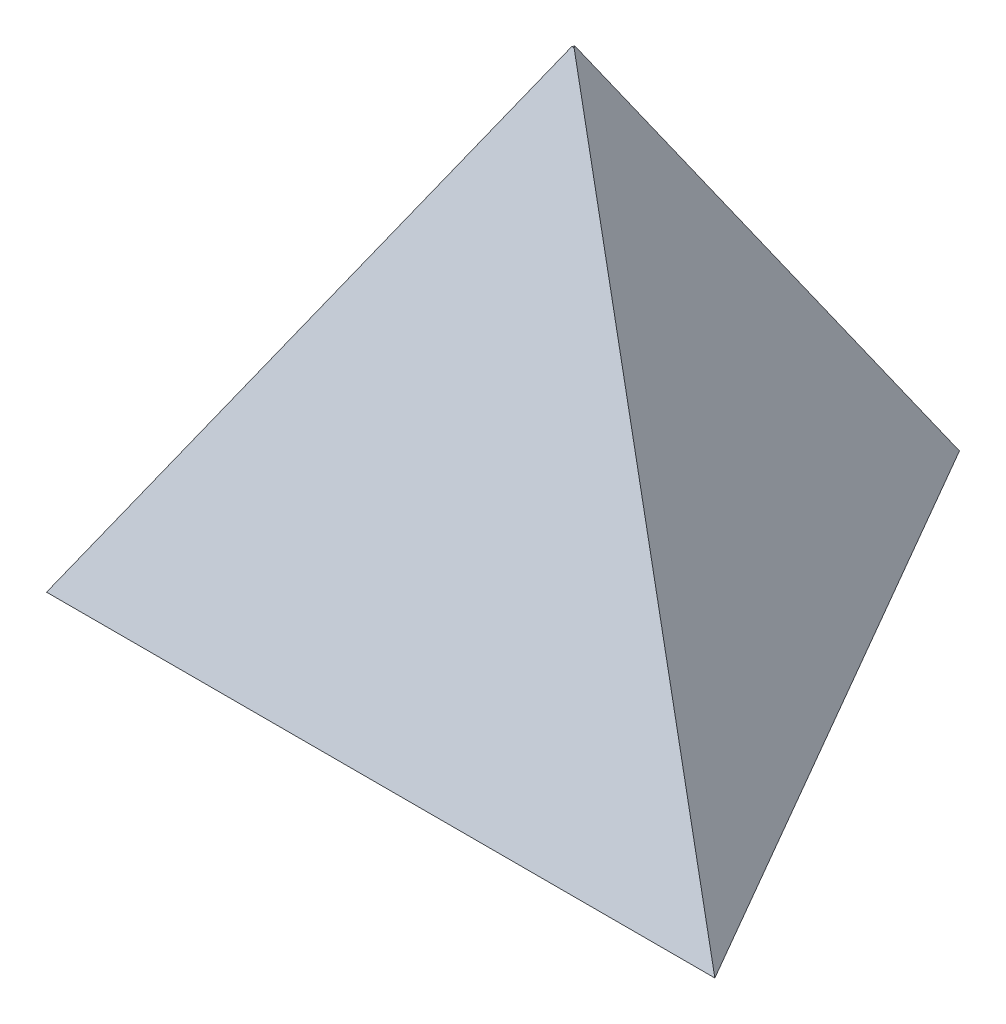
ISO-10303-21;
HEADER;
FILE_DESCRIPTION(('STEP AP214'),'2;1');
FILE_NAME('part.step','',(''),(''),'','','');
FILE_SCHEMA(('AUTOMOTIVE_DESIGN { 1 0 10303 214 1 1 1 1 }'));
ENDSEC;
DATA;
#1=APPLICATION_CONTEXT('core data for automotive mechanical design processes');
#2=APPLICATION_PROTOCOL_DEFINITION('international standard','automotive_design',2000,#1);
#3=PRODUCT_CONTEXT('',#1,'mechanical');
#4=PRODUCT('Part','Part','',(#3));
#5=PRODUCT_RELATED_PRODUCT_CATEGORY('part','',(#4));
#6=PRODUCT_DEFINITION_FORMATION('','',#4);
#7=PRODUCT_DEFINITION_CONTEXT('part definition',#1,'design');
#8=PRODUCT_DEFINITION('design','',#6,#7);
#9=PRODUCT_DEFINITION_SHAPE('','',#8);
#10=(LENGTH_UNIT() NAMED_UNIT(*) SI_UNIT(.MILLI.,.METRE.));
#11=(NAMED_UNIT(*) PLANE_ANGLE_UNIT() SI_UNIT($,.RADIAN.));
#12=(NAMED_UNIT(*) SI_UNIT($,.STERADIAN.) SOLID_ANGLE_UNIT());
#13=UNCERTAINTY_MEASURE_WITH_UNIT(LENGTH_MEASURE(1.E-05),#10,'distance_accuracy_value','');
#14=(GEOMETRIC_REPRESENTATION_CONTEXT(3) GLOBAL_UNCERTAINTY_ASSIGNED_CONTEXT((#13)) GLOBAL_UNIT_ASSIGNED_CONTEXT((#10,
#11,#12)) REPRESENTATION_CONTEXT('',''));
#15=CARTESIAN_POINT('',(0.,0.,0.));
#16=DIRECTION('',(0.,0.,1.));
#17=DIRECTION('',(1.,0.,0.));
#18=AXIS2_PLACEMENT_3D('',#15,#16,#17);
#19=CARTESIAN_POINT('',(-40.,0.,23.094010767585));
#20=DIRECTION('',(0.,0.333806859233772,0.942641491092178));
#21=DIRECTION('',(0.,-0.942641491092178,0.333806859233772));
#22=AXIS2_PLACEMENT_3D('',#19,#20,#21);
#23=PLANE('',#22);
#24=DIRECTION('',(1.,0.,0.));
#25=VECTOR('',#24,1.);
#26=CARTESIAN_POINT('',(-40.,0.,23.094010767585));
#27=LINE('',#26,#25);
#28=CARTESIAN_POINT('',(-40.,0.,23.094010767585));
#29=VERTEX_POINT('',#28);
#30=CARTESIAN_POINT('',(40.,0.,23.094010767585));
#31=VERTEX_POINT('',#30);
#32=EDGE_CURVE('E97',#29,#31,#27,.T.);
#33=ORIENTED_EDGE('',*,*,#32,.T.);
#34=DIRECTION('',(0.500532432884646,-0.816061503916281,0.288982534864089));
#35=VECTOR('',#34,1.);
#36=CARTESIAN_POINT('',(40.,0.,23.094010767585));
#37=LINE('',#36,#35);
#38=CARTESIAN_POINT('',(0.132161630749231,65.,0.0763035530896119));
#39=VERTEX_POINT('',#38);
#40=EDGE_CURVE('E11',#39,#31,#37,.T.);
#41=ORIENTED_EDGE('',*,*,#40,.F.);
#42=DIRECTION('',(-1.,0.,0.));
#43=VECTOR('',#42,1.);
#44=CARTESIAN_POINT('',(-40.,65.,0.0763035530896156));
#45=LINE('',#44,#43);
#46=CARTESIAN_POINT('',(-0.13216163074924,65.,0.0763035530896123));
#47=VERTEX_POINT('',#46);
#48=EDGE_CURVE('E108',#47,#39,#45,.F.);
#49=ORIENTED_EDGE('',*,*,#48,.F.);
#50=DIRECTION('',(-0.500532432884646,-0.816061503916281,0.288982534864089));
#51=VECTOR('',#50,1.);
#52=CARTESIAN_POINT('',(-40.,0.,23.094010767585));
#53=LINE('',#52,#51);
#54=EDGE_CURVE('E110',#47,#29,#53,.T.);
#55=ORIENTED_EDGE('',*,*,#54,.T.);
#56=EDGE_LOOP('',(#33,#41,#49,#55));
#57=FACE_BOUND('',#56,.T.);
#58=ADVANCED_FACE('F33',(#57),#23,.T.);
#59=CARTESIAN_POINT('',(40.,0.,23.094010767585));
#60=DIRECTION('',(0.816351477947069,0.333806859233772,-0.471320745546089));
#61=DIRECTION('',(-0.5,0.,-0.866025403784439));
#62=AXIS2_PLACEMENT_3D('',#59,#60,#61);
#63=PLANE('',#62);
#64=DIRECTION('',(-0.5,0.,-0.866025403784439));
#65=VECTOR('',#64,1.);
#66=CARTESIAN_POINT('',(40.,0.,23.094010767585));
#67=LINE('',#66,#65);
#68=CARTESIAN_POINT('',(0.,0.,-46.1880215351701));
#69=VERTEX_POINT('',#68);
#70=EDGE_CURVE('E100',#31,#69,#67,.T.);
#71=ORIENTED_EDGE('',*,*,#70,.T.);
#72=DIRECTION('',(0.,-0.816061503916281,-0.577965069728178));
#73=VECTOR('',#72,1.);
#74=CARTESIAN_POINT('',(0.,0.,-46.1880215351701));
#75=LINE('',#74,#73);
#76=CARTESIAN_POINT('',(0.,65.,-0.152607106179215));
#77=VERTEX_POINT('',#76);
#78=EDGE_CURVE('E42',#77,#69,#75,.T.);
#79=ORIENTED_EDGE('',*,*,#78,.F.);
#80=DIRECTION('',(0.5,0.,0.866025403784439));
#81=VECTOR('',#80,1.);
#82=CARTESIAN_POINT('',(20.0660808153746,65.,34.6028643748327));
#83=LINE('',#82,#81);
#84=EDGE_CURVE('E115',#39,#77,#83,.F.);
#85=ORIENTED_EDGE('',*,*,#84,.F.);
#86=ORIENTED_EDGE('',*,*,#40,.T.);
#87=EDGE_LOOP('',(#71,#79,#85,#86));
#88=FACE_BOUND('',#87,.T.);
#89=ADVANCED_FACE('F35',(#88),#63,.T.);
#90=CARTESIAN_POINT('',(0.,0.,-46.1880215351701));
#91=DIRECTION('',(-0.816351477947069,0.333806859233772,-0.471320745546089));
#92=DIRECTION('',(-0.5,0.,0.866025403784439));
#93=AXIS2_PLACEMENT_3D('',#90,#91,#92);
#94=PLANE('',#93);
#95=DIRECTION('',(-0.5,0.,0.866025403784439));
#96=VECTOR('',#95,1.);
#97=CARTESIAN_POINT('',(0.,0.,-46.1880215351701));
#98=LINE('',#97,#96);
#99=EDGE_CURVE('E107',#69,#29,#98,.T.);
#100=ORIENTED_EDGE('',*,*,#99,.T.);
#101=ORIENTED_EDGE('',*,*,#54,.F.);
#102=DIRECTION('',(0.5,0.,-0.866025403784439));
#103=VECTOR('',#102,1.);
#104=CARTESIAN_POINT('',(19.9339191846254,65.,-34.6791679279224));
#105=LINE('',#104,#103);
#106=EDGE_CURVE('E37',#77,#47,#105,.F.);
#107=ORIENTED_EDGE('',*,*,#106,.F.);
#108=ORIENTED_EDGE('',*,*,#78,.T.);
#109=EDGE_LOOP('',(#100,#101,#107,#108));
#110=FACE_BOUND('',#109,.T.);
#111=ADVANCED_FACE('F123',(#110),#94,.T.);
#112=CARTESIAN_POINT('',(0.,65.,0.));
#113=DIRECTION('',(0.,1.,0.));
#114=DIRECTION('',(0.,0.,1.));
#115=AXIS2_PLACEMENT_3D('',#112,#113,#114);
#116=PLANE('',#115);
#117=ORIENTED_EDGE('',*,*,#48,.T.);
#118=ORIENTED_EDGE('',*,*,#84,.T.);
#119=ORIENTED_EDGE('',*,*,#106,.T.);
#120=EDGE_LOOP('',(#117,#118,#119));
#121=FACE_BOUND('',#120,.T.);
#122=ADVANCED_FACE('F117',(#121),#116,.T.);
#123=CARTESIAN_POINT('',(0.,0.,0.));
#124=DIRECTION('',(0.,1.,0.));
#125=DIRECTION('',(0.,0.,1.));
#126=AXIS2_PLACEMENT_3D('',#123,#124,#125);
#127=PLANE('',#126);
#128=DIRECTION('',(0.5,0.,-0.866025403784439));
#129=VECTOR('',#128,1.);
#130=CARTESIAN_POINT('',(1.83744384682458,0.,-45.1271728355851));
#131=LINE('',#130,#129);
#132=CARTESIAN_POINT('',(0.,0.,-41.9446267368301));
#133=VERTEX_POINT('',#132);
#134=CARTESIAN_POINT('',(-36.3251123063508,0.,20.972313368415));
#135=VERTEX_POINT('',#134);
#136=EDGE_CURVE('E50',#133,#135,#131,.F.);
#137=ORIENTED_EDGE('',*,*,#136,.T.);
#138=DIRECTION('',(-1.,0.,0.));
#139=VECTOR('',#138,1.);
#140=CARTESIAN_POINT('',(-40.,0.,20.972313368415));
#141=LINE('',#140,#139);
#142=CARTESIAN_POINT('',(36.3251123063508,0.,20.972313368415));
#143=VERTEX_POINT('',#142);
#144=EDGE_CURVE('E88',#135,#143,#141,.F.);
#145=ORIENTED_EDGE('',*,*,#144,.T.);
#146=DIRECTION('',(0.5,0.,0.866025403784439));
#147=VECTOR('',#146,1.);
#148=CARTESIAN_POINT('',(38.1625561531754,0.,24.15485946717));
#149=LINE('',#148,#147);
#150=EDGE_CURVE('E96',#143,#133,#149,.F.);
#151=ORIENTED_EDGE('',*,*,#150,.T.);
#152=EDGE_LOOP('',(#137,#145,#151));
#153=FACE_BOUND('',#152,.T.);
#154=ORIENTED_EDGE('',*,*,#32,.F.);
#155=ORIENTED_EDGE('',*,*,#99,.F.);
#156=ORIENTED_EDGE('',*,*,#70,.F.);
#157=EDGE_LOOP('',(#154,#155,#156));
#158=FACE_BOUND('',#157,.T.);
#159=ADVANCED_FACE('F127',(#153,#158),#127,.F.);
#160=CARTESIAN_POINT('',(-40.,-0.667613718467543,21.2087277854007));
#161=DIRECTION('',(0.,0.333806859233772,0.942641491092178));
#162=DIRECTION('',(0.,-0.942641491092178,0.333806859233772));
#163=AXIS2_PLACEMENT_3D('',#160,#161,#162);
#164=PLANE('',#163);
#165=ORIENTED_EDGE('',*,*,#144,.F.);
#166=DIRECTION('',(-0.500532432884646,-0.816061503916281,0.288982534864089));
#167=VECTOR('',#166,1.);
#168=CARTESIAN_POINT('',(-37.5526851013408,-2.00141856037751,21.6810528520524));
#169=LINE('',#168,#167);
#170=CARTESIAN_POINT('',(0.,59.2239859619251,0.));
#171=VERTEX_POINT('',#170);
#172=EDGE_CURVE('E83',#171,#135,#169,.T.);
#173=ORIENTED_EDGE('',*,*,#172,.F.);
#174=DIRECTION('',(0.500532432884646,-0.816061503916281,0.288982534864089));
#175=VECTOR('',#174,1.);
#176=CARTESIAN_POINT('',(37.5526851013408,-2.00141856037751,21.6810528520524));
#177=LINE('',#176,#175);
#178=EDGE_CURVE('E86',#171,#143,#177,.T.);
#179=ORIENTED_EDGE('',*,*,#178,.T.);
#180=EDGE_LOOP('',(#165,#173,#179));
#181=FACE_BOUND('',#180,.T.);
#182=ADVANCED_FACE('F84',(#181),#164,.F.);
#183=CARTESIAN_POINT('',(38.3672970441059,-0.667613718467543,24.0366522586772));
#184=DIRECTION('',(0.816351477947069,0.333806859233772,-0.471320745546089));
#185=DIRECTION('',(-0.5,0.,-0.866025403784439));
#186=AXIS2_PLACEMENT_3D('',#183,#184,#185);
#187=PLANE('',#186);
#188=ORIENTED_EDGE('',*,*,#150,.F.);
#189=ORIENTED_EDGE('',*,*,#178,.F.);
#190=DIRECTION('',(0.,-0.816061503916281,-0.577965069728178));
#191=VECTOR('',#190,1.);
#192=CARTESIAN_POINT('',(0.,-2.00141856037751,-43.3621057041048));
#193=LINE('',#192,#191);
#194=EDGE_CURVE('E89',#171,#133,#193,.T.);
#195=ORIENTED_EDGE('',*,*,#194,.T.);
#196=EDGE_LOOP('',(#188,#189,#195));
#197=FACE_BOUND('',#196,.T.);
#198=ADVANCED_FACE('F95',(#197),#187,.F.);
#199=CARTESIAN_POINT('',(1.63270295589413,-0.667613718467543,-45.2453800440779));
#200=DIRECTION('',(-0.816351477947069,0.333806859233772,-0.471320745546089));
#201=DIRECTION('',(-0.5,0.,0.866025403784439));
#202=AXIS2_PLACEMENT_3D('',#199,#200,#201);
#203=PLANE('',#202);
#204=ORIENTED_EDGE('',*,*,#136,.F.);
#205=ORIENTED_EDGE('',*,*,#194,.F.);
#206=ORIENTED_EDGE('',*,*,#172,.T.);
#207=EDGE_LOOP('',(#204,#205,#206));
#208=FACE_BOUND('',#207,.T.);
#209=ADVANCED_FACE('F91',(#208),#203,.F.);
#210=CLOSED_SHELL('',(#58,#89,#111,#122,#159,#182,#198,#209));
#211=MANIFOLD_SOLID_BREP('B2',#210);
#212=ADVANCED_BREP_SHAPE_REPRESENTATION('',(#18,#211),#14);
#213=SHAPE_DEFINITION_REPRESENTATION(#9,#212);
ENDSEC;
END-ISO-10303-21;
